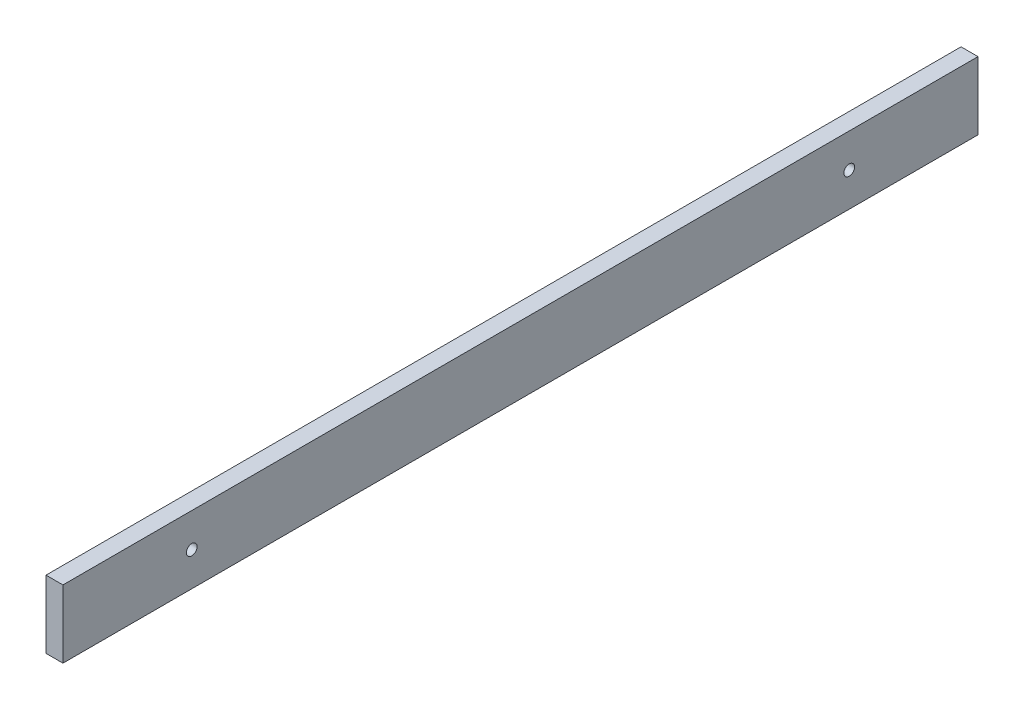
ISO-10303-21;
HEADER;
FILE_DESCRIPTION(('STEP AP214'),'2;1');
FILE_NAME('part.step','',(''),(''),'','','');
FILE_SCHEMA(('AUTOMOTIVE_DESIGN { 1 0 10303 214 1 1 1 1 }'));
ENDSEC;
DATA;
#1=APPLICATION_CONTEXT('core data for automotive mechanical design processes');
#2=APPLICATION_PROTOCOL_DEFINITION('international standard','automotive_design',2000,#1);
#3=PRODUCT_CONTEXT('',#1,'mechanical');
#4=PRODUCT('Part','Part','',(#3));
#5=PRODUCT_RELATED_PRODUCT_CATEGORY('part','',(#4));
#6=PRODUCT_DEFINITION_FORMATION('','',#4);
#7=PRODUCT_DEFINITION_CONTEXT('part definition',#1,'design');
#8=PRODUCT_DEFINITION('design','',#6,#7);
#9=PRODUCT_DEFINITION_SHAPE('','',#8);
#10=(LENGTH_UNIT() NAMED_UNIT(*) SI_UNIT(.MILLI.,.METRE.));
#11=(NAMED_UNIT(*) PLANE_ANGLE_UNIT() SI_UNIT($,.RADIAN.));
#12=(NAMED_UNIT(*) SI_UNIT($,.STERADIAN.) SOLID_ANGLE_UNIT());
#13=UNCERTAINTY_MEASURE_WITH_UNIT(LENGTH_MEASURE(1.E-05),#10,'distance_accuracy_value','');
#14=(GEOMETRIC_REPRESENTATION_CONTEXT(3) GLOBAL_UNCERTAINTY_ASSIGNED_CONTEXT((#13)) GLOBAL_UNIT_ASSIGNED_CONTEXT((#10,
#11,#12)) REPRESENTATION_CONTEXT('',''));
#15=CARTESIAN_POINT('',(0.,0.,0.));
#16=DIRECTION('',(0.,0.,1.));
#17=DIRECTION('',(1.,0.,0.));
#18=AXIS2_PLACEMENT_3D('',#15,#16,#17);
#19=CARTESIAN_POINT('',(5.,0.,0.));
#20=DIRECTION('',(-1.,0.,0.));
#21=DIRECTION('',(0.,0.,1.));
#22=AXIS2_PLACEMENT_3D('',#19,#20,#21);
#23=PLANE('',#22);
#24=DIRECTION('',(0.,1.,0.));
#25=VECTOR('',#24,1.);
#26=CARTESIAN_POINT('',(5.,-10.,-135.));
#27=LINE('',#26,#25);
#28=CARTESIAN_POINT('',(5.,-10.,-135.));
#29=VERTEX_POINT('',#28);
#30=CARTESIAN_POINT('',(5.,10.,-135.));
#31=VERTEX_POINT('',#30);
#32=EDGE_CURVE('E96',#29,#31,#27,.T.);
#33=ORIENTED_EDGE('',*,*,#32,.T.);
#34=DIRECTION('',(0.,0.,1.));
#35=VECTOR('',#34,1.);
#36=CARTESIAN_POINT('',(5.,10.,135.));
#37=LINE('',#36,#35);
#38=CARTESIAN_POINT('',(5.,10.,135.));
#39=VERTEX_POINT('',#38);
#40=EDGE_CURVE('E91',#31,#39,#37,.T.);
#41=ORIENTED_EDGE('',*,*,#40,.T.);
#42=DIRECTION('',(0.,-1.,0.));
#43=VECTOR('',#42,1.);
#44=CARTESIAN_POINT('',(5.,-10.,135.));
#45=LINE('',#44,#43);
#46=CARTESIAN_POINT('',(5.,-10.,135.));
#47=VERTEX_POINT('',#46);
#48=EDGE_CURVE('E94',#39,#47,#45,.T.);
#49=ORIENTED_EDGE('',*,*,#48,.T.);
#50=DIRECTION('',(0.,0.,-1.));
#51=VECTOR('',#50,1.);
#52=CARTESIAN_POINT('',(5.,-10.,135.));
#53=LINE('',#52,#51);
#54=EDGE_CURVE('E61',#47,#29,#53,.T.);
#55=ORIENTED_EDGE('',*,*,#54,.T.);
#56=EDGE_LOOP('',(#33,#41,#49,#55));
#57=FACE_BOUND('',#56,.T.);
#58=CARTESIAN_POINT('',(5.,0.,-97.));
#59=DIRECTION('',(1.,0.,0.));
#60=DIRECTION('',(0.,0.,-1.));
#61=AXIS2_PLACEMENT_3D('',#58,#59,#60);
#62=CIRCLE('',#61,1.58);
#63=CARTESIAN_POINT('',(5.,0.,-98.58));
#64=VERTEX_POINT('',#63);
#65=EDGE_CURVE('E116',#64,#64,#62,.T.);
#66=ORIENTED_EDGE('',*,*,#65,.F.);
#67=EDGE_LOOP('',(#66));
#68=FACE_BOUND('',#67,.T.);
#69=CARTESIAN_POINT('',(5.,0.,97.));
#70=DIRECTION('',(1.,0.,0.));
#71=DIRECTION('',(0.,0.,-1.));
#72=AXIS2_PLACEMENT_3D('',#69,#70,#71);
#73=CIRCLE('',#72,1.58);
#74=CARTESIAN_POINT('',(5.,0.,95.42));
#75=VERTEX_POINT('',#74);
#76=EDGE_CURVE('E138',#75,#75,#73,.T.);
#77=ORIENTED_EDGE('',*,*,#76,.F.);
#78=EDGE_LOOP('',(#77));
#79=FACE_BOUND('',#78,.T.);
#80=ADVANCED_FACE('F43',(#57,#68,#79),#23,.F.);
#81=CARTESIAN_POINT('',(0.,0.,0.));
#82=DIRECTION('',(-1.,0.,0.));
#83=DIRECTION('',(0.,0.,1.));
#84=AXIS2_PLACEMENT_3D('',#81,#82,#83);
#85=PLANE('',#84);
#86=CARTESIAN_POINT('',(0.,0.,-97.));
#87=DIRECTION('',(1.,0.,0.));
#88=DIRECTION('',(0.,0.,-1.));
#89=AXIS2_PLACEMENT_3D('',#86,#87,#88);
#90=CIRCLE('',#89,1.58);
#91=CARTESIAN_POINT('',(0.,0.,-98.58));
#92=VERTEX_POINT('',#91);
#93=EDGE_CURVE('E134',#92,#92,#90,.T.);
#94=ORIENTED_EDGE('',*,*,#93,.T.);
#95=EDGE_LOOP('',(#94));
#96=FACE_BOUND('',#95,.T.);
#97=DIRECTION('',(0.,1.,0.));
#98=VECTOR('',#97,1.);
#99=CARTESIAN_POINT('',(0.,-10.,-135.));
#100=LINE('',#99,#98);
#101=CARTESIAN_POINT('',(0.,-10.,-135.));
#102=VERTEX_POINT('',#101);
#103=CARTESIAN_POINT('',(0.,10.,-135.));
#104=VERTEX_POINT('',#103);
#105=EDGE_CURVE('E112',#102,#104,#100,.T.);
#106=ORIENTED_EDGE('',*,*,#105,.F.);
#107=DIRECTION('',(0.,0.,-1.));
#108=VECTOR('',#107,1.);
#109=CARTESIAN_POINT('',(0.,-10.,135.));
#110=LINE('',#109,#108);
#111=CARTESIAN_POINT('',(0.,-10.,135.));
#112=VERTEX_POINT('',#111);
#113=EDGE_CURVE('E84',#112,#102,#110,.T.);
#114=ORIENTED_EDGE('',*,*,#113,.F.);
#115=DIRECTION('',(0.,-1.,0.));
#116=VECTOR('',#115,1.);
#117=CARTESIAN_POINT('',(0.,-10.,135.));
#118=LINE('',#117,#116);
#119=CARTESIAN_POINT('',(0.,10.,135.));
#120=VERTEX_POINT('',#119);
#121=EDGE_CURVE('E78',#120,#112,#118,.T.);
#122=ORIENTED_EDGE('',*,*,#121,.F.);
#123=DIRECTION('',(0.,0.,1.));
#124=VECTOR('',#123,1.);
#125=CARTESIAN_POINT('',(0.,10.,135.));
#126=LINE('',#125,#124);
#127=EDGE_CURVE('E101',#104,#120,#126,.T.);
#128=ORIENTED_EDGE('',*,*,#127,.F.);
#129=EDGE_LOOP('',(#106,#114,#122,#128));
#130=FACE_BOUND('',#129,.T.);
#131=CARTESIAN_POINT('',(0.,0.,97.));
#132=DIRECTION('',(1.,0.,0.));
#133=DIRECTION('',(0.,0.,-1.));
#134=AXIS2_PLACEMENT_3D('',#131,#132,#133);
#135=CIRCLE('',#134,1.58);
#136=CARTESIAN_POINT('',(0.,0.,95.42));
#137=VERTEX_POINT('',#136);
#138=EDGE_CURVE('E142',#137,#137,#135,.T.);
#139=ORIENTED_EDGE('',*,*,#138,.T.);
#140=EDGE_LOOP('',(#139));
#141=FACE_BOUND('',#140,.T.);
#142=ADVANCED_FACE('F129',(#96,#130,#141),#85,.T.);
#143=CARTESIAN_POINT('',(5.,-10.,-135.));
#144=DIRECTION('',(0.,0.,1.));
#145=DIRECTION('',(1.,0.,0.));
#146=AXIS2_PLACEMENT_3D('',#143,#144,#145);
#147=PLANE('',#146);
#148=ORIENTED_EDGE('',*,*,#105,.T.);
#149=DIRECTION('',(-1.,0.,0.));
#150=VECTOR('',#149,1.);
#151=CARTESIAN_POINT('',(5.,10.,-135.));
#152=LINE('',#151,#150);
#153=EDGE_CURVE('E11',#31,#104,#152,.T.);
#154=ORIENTED_EDGE('',*,*,#153,.F.);
#155=ORIENTED_EDGE('',*,*,#32,.F.);
#156=DIRECTION('',(-1.,0.,0.));
#157=VECTOR('',#156,1.);
#158=CARTESIAN_POINT('',(5.,-10.,-135.));
#159=LINE('',#158,#157);
#160=EDGE_CURVE('E108',#29,#102,#159,.T.);
#161=ORIENTED_EDGE('',*,*,#160,.T.);
#162=EDGE_LOOP('',(#148,#154,#155,#161));
#163=FACE_BOUND('',#162,.T.);
#164=ADVANCED_FACE('F45',(#163),#147,.F.);
#165=CARTESIAN_POINT('',(5.,10.,135.));
#166=DIRECTION('',(0.,-1.,0.));
#167=DIRECTION('',(0.,0.,-1.));
#168=AXIS2_PLACEMENT_3D('',#165,#166,#167);
#169=PLANE('',#168);
#170=ORIENTED_EDGE('',*,*,#127,.T.);
#171=DIRECTION('',(-1.,0.,0.));
#172=VECTOR('',#171,1.);
#173=CARTESIAN_POINT('',(5.,10.,135.));
#174=LINE('',#173,#172);
#175=EDGE_CURVE('E53',#39,#120,#174,.T.);
#176=ORIENTED_EDGE('',*,*,#175,.F.);
#177=ORIENTED_EDGE('',*,*,#40,.F.);
#178=ORIENTED_EDGE('',*,*,#153,.T.);
#179=EDGE_LOOP('',(#170,#176,#177,#178));
#180=FACE_BOUND('',#179,.T.);
#181=ADVANCED_FACE('F100',(#180),#169,.F.);
#182=CARTESIAN_POINT('',(5.,-10.,135.));
#183=DIRECTION('',(0.,0.,-1.));
#184=DIRECTION('',(-1.,0.,0.));
#185=AXIS2_PLACEMENT_3D('',#182,#183,#184);
#186=PLANE('',#185);
#187=ORIENTED_EDGE('',*,*,#121,.T.);
#188=DIRECTION('',(-1.,0.,0.));
#189=VECTOR('',#188,1.);
#190=CARTESIAN_POINT('',(5.,-10.,135.));
#191=LINE('',#190,#189);
#192=EDGE_CURVE('E103',#47,#112,#191,.T.);
#193=ORIENTED_EDGE('',*,*,#192,.F.);
#194=ORIENTED_EDGE('',*,*,#48,.F.);
#195=ORIENTED_EDGE('',*,*,#175,.T.);
#196=EDGE_LOOP('',(#187,#193,#194,#195));
#197=FACE_BOUND('',#196,.T.);
#198=ADVANCED_FACE('F104',(#197),#186,.F.);
#199=CARTESIAN_POINT('',(5.,-10.,135.));
#200=DIRECTION('',(0.,1.,0.));
#201=DIRECTION('',(0.,0.,1.));
#202=AXIS2_PLACEMENT_3D('',#199,#200,#201);
#203=PLANE('',#202);
#204=ORIENTED_EDGE('',*,*,#113,.T.);
#205=ORIENTED_EDGE('',*,*,#160,.F.);
#206=ORIENTED_EDGE('',*,*,#54,.F.);
#207=ORIENTED_EDGE('',*,*,#192,.T.);
#208=EDGE_LOOP('',(#204,#205,#206,#207));
#209=FACE_BOUND('',#208,.T.);
#210=ADVANCED_FACE('F126',(#209),#203,.F.);
#211=CARTESIAN_POINT('',(5.,0.,-97.));
#212=DIRECTION('',(-1.,0.,0.));
#213=DIRECTION('',(0.,0.,1.));
#214=AXIS2_PLACEMENT_3D('',#211,#212,#213);
#215=CYLINDRICAL_SURFACE('',#214,1.58);
#216=ORIENTED_EDGE('',*,*,#65,.T.);
#217=EDGE_LOOP('',(#216));
#218=FACE_BOUND('',#217,.T.);
#219=ORIENTED_EDGE('',*,*,#93,.F.);
#220=EDGE_LOOP('',(#219));
#221=FACE_BOUND('',#220,.T.);
#222=ADVANCED_FACE('F161',(#218,#221),#215,.F.);
#223=CARTESIAN_POINT('',(5.,0.,97.));
#224=DIRECTION('',(-1.,0.,0.));
#225=DIRECTION('',(0.,0.,1.));
#226=AXIS2_PLACEMENT_3D('',#223,#224,#225);
#227=CYLINDRICAL_SURFACE('',#226,1.58);
#228=ORIENTED_EDGE('',*,*,#76,.T.);
#229=EDGE_LOOP('',(#228));
#230=FACE_BOUND('',#229,.T.);
#231=ORIENTED_EDGE('',*,*,#138,.F.);
#232=EDGE_LOOP('',(#231));
#233=FACE_BOUND('',#232,.T.);
#234=ADVANCED_FACE('F150',(#230,#233),#227,.F.);
#235=CLOSED_SHELL('',(#80,#142,#164,#181,#198,#210,#222,#234));
#236=MANIFOLD_SOLID_BREP('B2',#235);
#237=ADVANCED_BREP_SHAPE_REPRESENTATION('',(#18,#236),#14);
#238=SHAPE_DEFINITION_REPRESENTATION(#9,#237);
ENDSEC;
END-ISO-10303-21;
